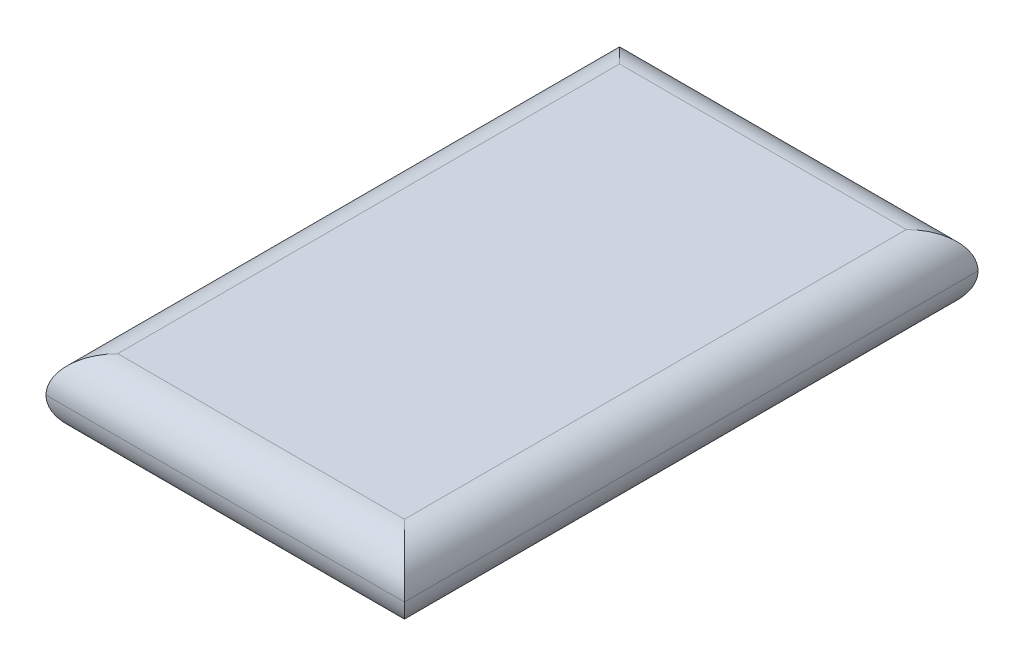
ISO-10303-21;
HEADER;
FILE_DESCRIPTION(('STEP AP214'),'2;1');
FILE_NAME('part.step','',(''),(''),'','','');
FILE_SCHEMA(('AUTOMOTIVE_DESIGN { 1 0 10303 214 1 1 1 1 }'));
ENDSEC;
DATA;
#1=APPLICATION_CONTEXT('core data for automotive mechanical design processes');
#2=APPLICATION_PROTOCOL_DEFINITION('international standard','automotive_design',2000,#1);
#3=PRODUCT_CONTEXT('',#1,'mechanical');
#4=PRODUCT('Part','Part','',(#3));
#5=PRODUCT_RELATED_PRODUCT_CATEGORY('part','',(#4));
#6=PRODUCT_DEFINITION_FORMATION('','',#4);
#7=PRODUCT_DEFINITION_CONTEXT('part definition',#1,'design');
#8=PRODUCT_DEFINITION('design','',#6,#7);
#9=PRODUCT_DEFINITION_SHAPE('','',#8);
#10=(LENGTH_UNIT() NAMED_UNIT(*) SI_UNIT(.MILLI.,.METRE.));
#11=(NAMED_UNIT(*) PLANE_ANGLE_UNIT() SI_UNIT($,.RADIAN.));
#12=(NAMED_UNIT(*) SI_UNIT($,.STERADIAN.) SOLID_ANGLE_UNIT());
#13=UNCERTAINTY_MEASURE_WITH_UNIT(LENGTH_MEASURE(1.E-05),#10,'distance_accuracy_value','');
#14=(GEOMETRIC_REPRESENTATION_CONTEXT(3) GLOBAL_UNCERTAINTY_ASSIGNED_CONTEXT((#13)) GLOBAL_UNIT_ASSIGNED_CONTEXT((#10,
#11,#12)) REPRESENTATION_CONTEXT('',''));
#15=CARTESIAN_POINT('',(0.,0.,0.));
#16=DIRECTION('',(0.,0.,1.));
#17=DIRECTION('',(1.,0.,0.));
#18=AXIS2_PLACEMENT_3D('',#15,#16,#17);
#19=CARTESIAN_POINT('',(25.4,2.54,20.32));
#20=DIRECTION('',(0.,-1.,0.));
#21=DIRECTION('',(0.,0.,-1.));
#22=AXIS2_PLACEMENT_3D('',#19,#20,#21);
#23=PLANE('',#22);
#24=DIRECTION('',(0.,0.,1.));
#25=VECTOR('',#24,1.);
#26=CARTESIAN_POINT('',(22.86,2.54,-20.32));
#27=LINE('',#26,#25);
#28=CARTESIAN_POINT('',(22.86,2.54,17.78));
#29=VERTEX_POINT('',#28);
#30=CARTESIAN_POINT('',(22.86,2.54,-17.78));
#31=VERTEX_POINT('',#30);
#32=EDGE_CURVE('E46',#29,#31,#27,.F.);
#33=ORIENTED_EDGE('',*,*,#32,.T.);
#34=DIRECTION('',(-1.,0.,0.));
#35=VECTOR('',#34,1.);
#36=CARTESIAN_POINT('',(25.4,2.54,-17.78));
#37=LINE('',#36,#35);
#38=CARTESIAN_POINT('',(2.54,2.54,-17.78));
#39=VERTEX_POINT('',#38);
#40=EDGE_CURVE('E11',#31,#39,#37,.T.);
#41=ORIENTED_EDGE('',*,*,#40,.T.);
#42=DIRECTION('',(0.,0.,1.));
#43=VECTOR('',#42,1.);
#44=CARTESIAN_POINT('',(2.54,2.54,20.32));
#45=LINE('',#44,#43);
#46=CARTESIAN_POINT('',(2.54,2.54,17.78));
#47=VERTEX_POINT('',#46);
#48=EDGE_CURVE('E95',#39,#47,#45,.T.);
#49=ORIENTED_EDGE('',*,*,#48,.T.);
#50=DIRECTION('',(-1.,0.,0.));
#51=VECTOR('',#50,1.);
#52=CARTESIAN_POINT('',(25.4,2.54,17.78));
#53=LINE('',#52,#51);
#54=EDGE_CURVE('E98',#47,#29,#53,.F.);
#55=ORIENTED_EDGE('',*,*,#54,.T.);
#56=EDGE_LOOP('',(#33,#41,#49,#55));
#57=FACE_BOUND('',#56,.T.);
#58=ADVANCED_FACE('F36',(#57),#23,.F.);
#59=CARTESIAN_POINT('',(25.4,-2.54,20.32));
#60=DIRECTION('',(0.,1.,0.));
#61=DIRECTION('',(0.,0.,1.));
#62=AXIS2_PLACEMENT_3D('',#59,#60,#61);
#63=PLANE('',#62);
#64=DIRECTION('',(0.,0.,-1.));
#65=VECTOR('',#64,1.);
#66=CARTESIAN_POINT('',(22.86,-2.54,20.32));
#67=LINE('',#66,#65);
#68=CARTESIAN_POINT('',(22.86,-2.54,-17.78));
#69=VERTEX_POINT('',#68);
#70=CARTESIAN_POINT('',(22.86,-2.54,17.78));
#71=VERTEX_POINT('',#70);
#72=EDGE_CURVE('E146',#69,#71,#67,.F.);
#73=ORIENTED_EDGE('',*,*,#72,.T.);
#74=DIRECTION('',(-1.,0.,0.));
#75=VECTOR('',#74,1.);
#76=CARTESIAN_POINT('',(25.4,-2.54,17.78));
#77=LINE('',#76,#75);
#78=CARTESIAN_POINT('',(2.54,-2.54,17.78));
#79=VERTEX_POINT('',#78);
#80=EDGE_CURVE('E100',#71,#79,#77,.T.);
#81=ORIENTED_EDGE('',*,*,#80,.T.);
#82=DIRECTION('',(0.,0.,-1.));
#83=VECTOR('',#82,1.);
#84=CARTESIAN_POINT('',(2.54,-2.54,20.32));
#85=LINE('',#84,#83);
#86=CARTESIAN_POINT('',(2.54,-2.54,-17.78));
#87=VERTEX_POINT('',#86);
#88=EDGE_CURVE('E139',#79,#87,#85,.T.);
#89=ORIENTED_EDGE('',*,*,#88,.T.);
#90=DIRECTION('',(-1.,0.,0.));
#91=VECTOR('',#90,1.);
#92=CARTESIAN_POINT('',(25.4,-2.54,-17.78));
#93=LINE('',#92,#91);
#94=EDGE_CURVE('E141',#87,#69,#93,.F.);
#95=ORIENTED_EDGE('',*,*,#94,.T.);
#96=EDGE_LOOP('',(#73,#81,#89,#95));
#97=FACE_BOUND('',#96,.T.);
#98=ADVANCED_FACE('F149',(#97),#63,.F.);
#99=CARTESIAN_POINT('',(25.4,0.,-17.78));
#100=DIRECTION('',(-1.,0.,0.));
#101=DIRECTION('',(0.,0.,1.));
#102=AXIS2_PLACEMENT_3D('',#99,#100,#101);
#103=CYLINDRICAL_SURFACE('',#102,2.54);
#104=CARTESIAN_POINT('',(2.54,0.,-17.78));
#105=DIRECTION('',(-0.707106781186547,0.,0.707106781186547));
#106=DIRECTION('',(0.707106781186547,0.,0.707106781186547));
#107=AXIS2_PLACEMENT_3D('',#104,#105,#106);
#108=ELLIPSE('',#107,3.59210244842766,2.54);
#109=CARTESIAN_POINT('',(0.,0.,-20.32));
#110=VERTEX_POINT('',#109);
#111=EDGE_CURVE('E109',#39,#110,#108,.T.);
#112=ORIENTED_EDGE('',*,*,#111,.F.);
#113=ORIENTED_EDGE('',*,*,#40,.F.);
#114=CARTESIAN_POINT('',(22.86,0.,-17.78));
#115=DIRECTION('',(-0.707106781186547,0.,-0.707106781186547));
#116=DIRECTION('',(0.707106781186547,0.,-0.707106781186547));
#117=AXIS2_PLACEMENT_3D('',#114,#115,#116);
#118=ELLIPSE('',#117,3.59210244842766,2.54);
#119=CARTESIAN_POINT('',(25.4,0.,-20.32));
#120=VERTEX_POINT('',#119);
#121=EDGE_CURVE('E40',#120,#31,#118,.F.);
#122=ORIENTED_EDGE('',*,*,#121,.F.);
#123=DIRECTION('',(-1.,0.,0.));
#124=VECTOR('',#123,1.);
#125=CARTESIAN_POINT('',(25.4,0.,-20.32));
#126=LINE('',#125,#124);
#127=EDGE_CURVE('E70',#110,#120,#126,.F.);
#128=ORIENTED_EDGE('',*,*,#127,.F.);
#129=EDGE_LOOP('',(#112,#113,#122,#128));
#130=FACE_BOUND('',#129,.T.);
#131=ADVANCED_FACE('F38',(#130),#103,.T.);
#132=CARTESIAN_POINT('',(22.86,0.,0.));
#133=DIRECTION('',(0.,0.,-1.));
#134=DIRECTION('',(-1.,0.,0.));
#135=AXIS2_PLACEMENT_3D('',#132,#133,#134);
#136=CYLINDRICAL_SURFACE('',#135,2.54);
#137=ORIENTED_EDGE('',*,*,#121,.T.);
#138=ORIENTED_EDGE('',*,*,#32,.F.);
#139=CARTESIAN_POINT('',(22.86,0.,17.78));
#140=DIRECTION('',(-0.707106781186547,0.,0.707106781186547));
#141=DIRECTION('',(-0.707106781186547,0.,-0.707106781186547));
#142=AXIS2_PLACEMENT_3D('',#139,#140,#141);
#143=ELLIPSE('',#142,3.59210244842766,2.54);
#144=CARTESIAN_POINT('',(25.4,0.,20.32));
#145=VERTEX_POINT('',#144);
#146=EDGE_CURVE('E110',#145,#29,#143,.T.);
#147=ORIENTED_EDGE('',*,*,#146,.F.);
#148=DIRECTION('',(0.,0.,1.));
#149=VECTOR('',#148,1.);
#150=CARTESIAN_POINT('',(25.4,0.,20.32));
#151=LINE('',#150,#149);
#152=EDGE_CURVE('E131',#120,#145,#151,.T.);
#153=ORIENTED_EDGE('',*,*,#152,.F.);
#154=EDGE_LOOP('',(#137,#138,#147,#153));
#155=FACE_BOUND('',#154,.T.);
#156=ADVANCED_FACE('F155',(#155),#136,.T.);
#157=CARTESIAN_POINT('',(25.4,0.,-17.78));
#158=DIRECTION('',(-1.,0.,0.));
#159=DIRECTION('',(0.,0.,1.));
#160=AXIS2_PLACEMENT_3D('',#157,#158,#159);
#161=CYLINDRICAL_SURFACE('',#160,2.54);
#162=CARTESIAN_POINT('',(2.54,0.,-17.78));
#163=DIRECTION('',(0.707106781186547,0.,-0.707106781186547));
#164=DIRECTION('',(-0.707106781186547,0.,-0.707106781186547));
#165=AXIS2_PLACEMENT_3D('',#162,#163,#164);
#166=ELLIPSE('',#165,3.59210244842766,2.54);
#167=EDGE_CURVE('E125',#110,#87,#166,.F.);
#168=ORIENTED_EDGE('',*,*,#167,.F.);
#169=ORIENTED_EDGE('',*,*,#127,.T.);
#170=CARTESIAN_POINT('',(22.86,0.,-17.78));
#171=DIRECTION('',(-0.707106781186547,0.,-0.707106781186547));
#172=DIRECTION('',(-0.707106781186547,0.,0.707106781186547));
#173=AXIS2_PLACEMENT_3D('',#170,#171,#172);
#174=ELLIPSE('',#173,3.59210244842766,2.54);
#175=EDGE_CURVE('E128',#69,#120,#174,.F.);
#176=ORIENTED_EDGE('',*,*,#175,.F.);
#177=ORIENTED_EDGE('',*,*,#94,.F.);
#178=EDGE_LOOP('',(#168,#169,#176,#177));
#179=FACE_BOUND('',#178,.T.);
#180=ADVANCED_FACE('F157',(#179),#161,.T.);
#181=CARTESIAN_POINT('',(2.54,0.,20.32));
#182=DIRECTION('',(0.,0.,1.));
#183=DIRECTION('',(1.,0.,0.));
#184=AXIS2_PLACEMENT_3D('',#181,#182,#183);
#185=CYLINDRICAL_SURFACE('',#184,2.54);
#186=CARTESIAN_POINT('',(2.54,0.,17.78));
#187=DIRECTION('',(0.707106781186547,0.,0.707106781186547));
#188=DIRECTION('',(-0.707106781186547,0.,0.707106781186547));
#189=AXIS2_PLACEMENT_3D('',#186,#187,#188);
#190=ELLIPSE('',#189,3.59210244842766,2.54);
#191=CARTESIAN_POINT('',(0.,0.,20.32));
#192=VERTEX_POINT('',#191);
#193=EDGE_CURVE('E103',#47,#192,#190,.T.);
#194=ORIENTED_EDGE('',*,*,#193,.F.);
#195=ORIENTED_EDGE('',*,*,#48,.F.);
#196=ORIENTED_EDGE('',*,*,#111,.T.);
#197=DIRECTION('',(0.,0.,1.));
#198=VECTOR('',#197,1.);
#199=CARTESIAN_POINT('',(0.,0.,0.));
#200=LINE('',#199,#198);
#201=EDGE_CURVE('E106',#192,#110,#200,.F.);
#202=ORIENTED_EDGE('',*,*,#201,.F.);
#203=EDGE_LOOP('',(#194,#195,#196,#202));
#204=FACE_BOUND('',#203,.T.);
#205=ADVANCED_FACE('F104',(#204),#185,.T.);
#206=CARTESIAN_POINT('',(25.4,0.,17.78));
#207=DIRECTION('',(-1.,0.,0.));
#208=DIRECTION('',(0.,0.,1.));
#209=AXIS2_PLACEMENT_3D('',#206,#207,#208);
#210=CYLINDRICAL_SURFACE('',#209,2.54);
#211=ORIENTED_EDGE('',*,*,#54,.F.);
#212=ORIENTED_EDGE('',*,*,#193,.T.);
#213=DIRECTION('',(-1.,0.,0.));
#214=VECTOR('',#213,1.);
#215=CARTESIAN_POINT('',(25.4,0.,20.32));
#216=LINE('',#215,#214);
#217=EDGE_CURVE('E122',#145,#192,#216,.T.);
#218=ORIENTED_EDGE('',*,*,#217,.F.);
#219=ORIENTED_EDGE('',*,*,#146,.T.);
#220=EDGE_LOOP('',(#211,#212,#218,#219));
#221=FACE_BOUND('',#220,.T.);
#222=ADVANCED_FACE('F113',(#221),#210,.T.);
#223=CARTESIAN_POINT('',(22.86,0.,0.));
#224=DIRECTION('',(0.,0.,1.));
#225=DIRECTION('',(1.,0.,0.));
#226=AXIS2_PLACEMENT_3D('',#223,#224,#225);
#227=CYLINDRICAL_SURFACE('',#226,2.54);
#228=ORIENTED_EDGE('',*,*,#175,.T.);
#229=ORIENTED_EDGE('',*,*,#152,.T.);
#230=CARTESIAN_POINT('',(22.86,0.,17.78));
#231=DIRECTION('',(-0.707106781186547,0.,0.707106781186547));
#232=DIRECTION('',(0.707106781186547,0.,0.707106781186547));
#233=AXIS2_PLACEMENT_3D('',#230,#231,#232);
#234=ELLIPSE('',#233,3.59210244842766,2.54);
#235=EDGE_CURVE('E119',#71,#145,#234,.T.);
#236=ORIENTED_EDGE('',*,*,#235,.F.);
#237=ORIENTED_EDGE('',*,*,#72,.F.);
#238=EDGE_LOOP('',(#228,#229,#236,#237));
#239=FACE_BOUND('',#238,.T.);
#240=ADVANCED_FACE('F154',(#239),#227,.T.);
#241=CARTESIAN_POINT('',(2.54,0.,20.32));
#242=DIRECTION('',(0.,0.,-1.));
#243=DIRECTION('',(-1.,0.,0.));
#244=AXIS2_PLACEMENT_3D('',#241,#242,#243);
#245=CYLINDRICAL_SURFACE('',#244,2.54);
#246=ORIENTED_EDGE('',*,*,#167,.T.);
#247=ORIENTED_EDGE('',*,*,#88,.F.);
#248=CARTESIAN_POINT('',(2.54,0.,17.78));
#249=DIRECTION('',(-0.707106781186547,0.,-0.707106781186547));
#250=DIRECTION('',(0.707106781186547,0.,-0.707106781186547));
#251=AXIS2_PLACEMENT_3D('',#248,#249,#250);
#252=ELLIPSE('',#251,3.59210244842766,2.54);
#253=EDGE_CURVE('E81',#192,#79,#252,.F.);
#254=ORIENTED_EDGE('',*,*,#253,.F.);
#255=ORIENTED_EDGE('',*,*,#201,.T.);
#256=EDGE_LOOP('',(#246,#247,#254,#255));
#257=FACE_BOUND('',#256,.T.);
#258=ADVANCED_FACE('F172',(#257),#245,.T.);
#259=CARTESIAN_POINT('',(25.4,0.,17.78));
#260=DIRECTION('',(-1.,0.,0.));
#261=DIRECTION('',(0.,0.,1.));
#262=AXIS2_PLACEMENT_3D('',#259,#260,#261);
#263=CYLINDRICAL_SURFACE('',#262,2.54);
#264=ORIENTED_EDGE('',*,*,#235,.T.);
#265=ORIENTED_EDGE('',*,*,#217,.T.);
#266=ORIENTED_EDGE('',*,*,#253,.T.);
#267=ORIENTED_EDGE('',*,*,#80,.F.);
#268=EDGE_LOOP('',(#264,#265,#266,#267));
#269=FACE_BOUND('',#268,.T.);
#270=ADVANCED_FACE('F152',(#269),#263,.T.);
#271=CLOSED_SHELL('',(#58,#98,#131,#156,#180,#205,#222,#240,#258,#270));
#272=MANIFOLD_SOLID_BREP('B2',#271);
#273=ADVANCED_BREP_SHAPE_REPRESENTATION('',(#18,#272),#14);
#274=SHAPE_DEFINITION_REPRESENTATION(#9,#273);
ENDSEC;
END-ISO-10303-21;
